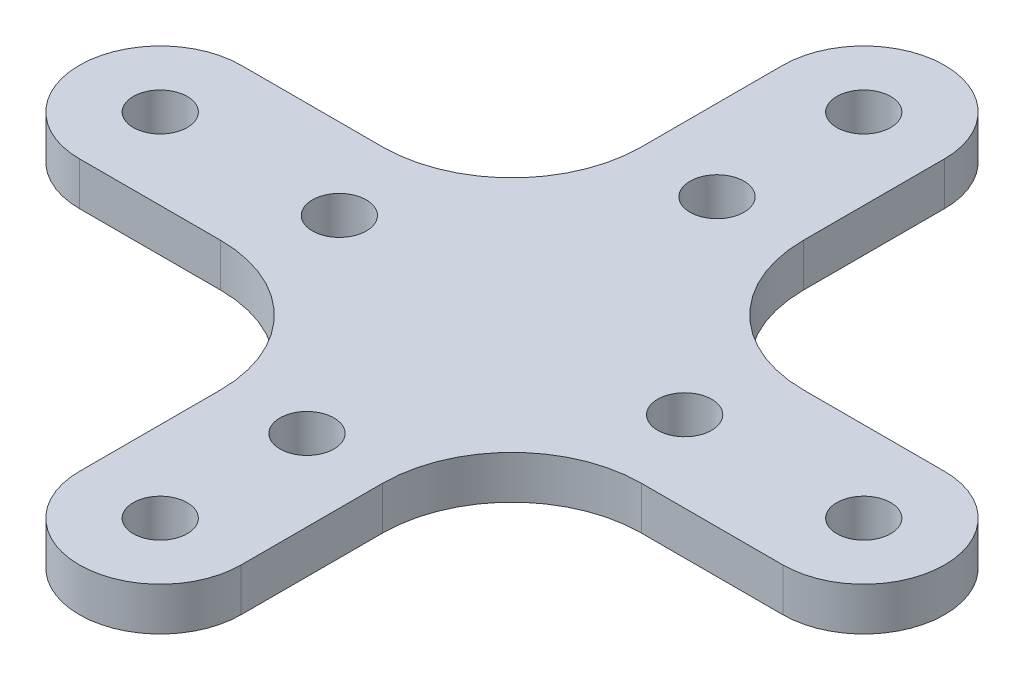
ISO-10303-21;
HEADER;
FILE_DESCRIPTION(('STEP AP214'),'2;1');
FILE_NAME('part.step','',(''),(''),'','','');
FILE_SCHEMA(('AUTOMOTIVE_DESIGN { 1 0 10303 214 1 1 1 1 }'));
ENDSEC;
DATA;
#1=APPLICATION_CONTEXT('core data for automotive mechanical design processes');
#2=APPLICATION_PROTOCOL_DEFINITION('international standard','automotive_design',2000,#1);
#3=PRODUCT_CONTEXT('',#1,'mechanical');
#4=PRODUCT('Part','Part','',(#3));
#5=PRODUCT_RELATED_PRODUCT_CATEGORY('part','',(#4));
#6=PRODUCT_DEFINITION_FORMATION('','',#4);
#7=PRODUCT_DEFINITION_CONTEXT('part definition',#1,'design');
#8=PRODUCT_DEFINITION('design','',#6,#7);
#9=PRODUCT_DEFINITION_SHAPE('','',#8);
#10=(LENGTH_UNIT() NAMED_UNIT(*) SI_UNIT(.MILLI.,.METRE.));
#11=(NAMED_UNIT(*) PLANE_ANGLE_UNIT() SI_UNIT($,.RADIAN.));
#12=(NAMED_UNIT(*) SI_UNIT($,.STERADIAN.) SOLID_ANGLE_UNIT());
#13=UNCERTAINTY_MEASURE_WITH_UNIT(LENGTH_MEASURE(1.E-05),#10,'distance_accuracy_value','');
#14=(GEOMETRIC_REPRESENTATION_CONTEXT(3) GLOBAL_UNCERTAINTY_ASSIGNED_CONTEXT((#13)) GLOBAL_UNIT_ASSIGNED_CONTEXT((#10,
#11,#12)) REPRESENTATION_CONTEXT('',''));
#15=CARTESIAN_POINT('',(0.,0.,0.));
#16=DIRECTION('',(0.,0.,1.));
#17=DIRECTION('',(1.,0.,0.));
#18=AXIS2_PLACEMENT_3D('',#15,#16,#17);
#19=CARTESIAN_POINT('',(0.,2.,-16.3));
#20=DIRECTION('',(0.,1.,0.));
#21=DIRECTION('',(0.,0.,1.));
#22=AXIS2_PLACEMENT_3D('',#19,#20,#21);
#23=PLANE('',#22);
#24=CARTESIAN_POINT('',(0.,2.,9.5));
#25=DIRECTION('',(0.,1.,0.));
#26=DIRECTION('',(0.,0.,1.));
#27=AXIS2_PLACEMENT_3D('',#24,#25,#26);
#28=CIRCLE('',#27,1.25);
#29=CARTESIAN_POINT('',(0.,2.,10.75));
#30=VERTEX_POINT('',#29);
#31=EDGE_CURVE('E412',#30,#30,#28,.T.);
#32=ORIENTED_EDGE('',*,*,#31,.F.);
#33=EDGE_LOOP('',(#32));
#34=FACE_BOUND('',#33,.T.);
#35=CARTESIAN_POINT('',(0.,2.,-9.5));
#36=DIRECTION('',(0.,1.,0.));
#37=DIRECTION('',(0.,0.,1.));
#38=AXIS2_PLACEMENT_3D('',#35,#36,#37);
#39=CIRCLE('',#38,1.25);
#40=CARTESIAN_POINT('',(0.,2.,-8.25));
#41=VERTEX_POINT('',#40);
#42=EDGE_CURVE('E428',#41,#41,#39,.T.);
#43=ORIENTED_EDGE('',*,*,#42,.F.);
#44=EDGE_LOOP('',(#43));
#45=FACE_BOUND('',#44,.T.);
#46=CARTESIAN_POINT('',(0.,2.,16.3));
#47=DIRECTION('',(0.,1.,0.));
#48=DIRECTION('',(0.,0.,1.));
#49=AXIS2_PLACEMENT_3D('',#46,#47,#48);
#50=CIRCLE('',#49,1.25);
#51=CARTESIAN_POINT('',(0.,2.,17.55));
#52=VERTEX_POINT('',#51);
#53=EDGE_CURVE('E444',#52,#52,#50,.T.);
#54=ORIENTED_EDGE('',*,*,#53,.F.);
#55=EDGE_LOOP('',(#54));
#56=FACE_BOUND('',#55,.T.);
#57=CARTESIAN_POINT('',(0.,2.,-16.3));
#58=DIRECTION('',(0.,1.,0.));
#59=DIRECTION('',(0.,0.,1.));
#60=AXIS2_PLACEMENT_3D('',#57,#58,#59);
#61=CIRCLE('',#60,1.25);
#62=CARTESIAN_POINT('',(0.,2.,-15.05));
#63=VERTEX_POINT('',#62);
#64=EDGE_CURVE('E194',#63,#63,#61,.T.);
#65=ORIENTED_EDGE('',*,*,#64,.F.);
#66=EDGE_LOOP('',(#65));
#67=FACE_BOUND('',#66,.T.);
#68=CARTESIAN_POINT('',(0.,2.,-16.3));
#69=DIRECTION('',(0.,1.,0.));
#70=DIRECTION('',(0.,0.,1.));
#71=AXIS2_PLACEMENT_3D('',#68,#69,#70);
#72=CIRCLE('',#71,3.75);
#73=CARTESIAN_POINT('',(3.74999999999999,2.,-16.3));
#74=VERTEX_POINT('',#73);
#75=CARTESIAN_POINT('',(-3.75,2.,-16.3));
#76=VERTEX_POINT('',#75);
#77=EDGE_CURVE('E236',#74,#76,#72,.T.);
#78=ORIENTED_EDGE('',*,*,#77,.T.);
#79=DIRECTION('',(0.,0.,1.));
#80=VECTOR('',#79,1.);
#81=CARTESIAN_POINT('',(-3.75,2.,-16.3));
#82=LINE('',#81,#80);
#83=CARTESIAN_POINT('',(-3.75,2.,-9.75000000000005));
#84=VERTEX_POINT('',#83);
#85=EDGE_CURVE('E124',#76,#84,#82,.T.);
#86=ORIENTED_EDGE('',*,*,#85,.T.);
#87=CARTESIAN_POINT('',(-9.75,2.,-9.75000000000001));
#88=DIRECTION('',(0.,-1.,0.));
#89=DIRECTION('',(0.,0.,-1.));
#90=AXIS2_PLACEMENT_3D('',#87,#88,#89);
#91=CIRCLE('',#90,6.);
#92=CARTESIAN_POINT('',(-9.75000000000004,2.,-3.75));
#93=VERTEX_POINT('',#92);
#94=EDGE_CURVE('E289',#84,#93,#91,.T.);
#95=ORIENTED_EDGE('',*,*,#94,.T.);
#96=DIRECTION('',(-1.,0.,0.));
#97=VECTOR('',#96,1.);
#98=CARTESIAN_POINT('',(-16.3,2.,-3.75));
#99=LINE('',#98,#97);
#100=CARTESIAN_POINT('',(-16.3,2.,-3.75));
#101=VERTEX_POINT('',#100);
#102=EDGE_CURVE('E309',#93,#101,#99,.T.);
#103=ORIENTED_EDGE('',*,*,#102,.T.);
#104=CARTESIAN_POINT('',(-16.3,2.,0.));
#105=DIRECTION('',(0.,1.,0.));
#106=DIRECTION('',(0.,0.,1.));
#107=AXIS2_PLACEMENT_3D('',#104,#105,#106);
#108=CIRCLE('',#107,3.75);
#109=CARTESIAN_POINT('',(-16.3,2.,3.75));
#110=VERTEX_POINT('',#109);
#111=EDGE_CURVE('E305',#101,#110,#108,.T.);
#112=ORIENTED_EDGE('',*,*,#111,.T.);
#113=DIRECTION('',(1.,0.,0.));
#114=VECTOR('',#113,1.);
#115=CARTESIAN_POINT('',(-16.3,2.,3.75));
#116=LINE('',#115,#114);
#117=CARTESIAN_POINT('',(-9.75000000000004,2.,3.75));
#118=VERTEX_POINT('',#117);
#119=EDGE_CURVE('E308',#110,#118,#116,.T.);
#120=ORIENTED_EDGE('',*,*,#119,.T.);
#121=CARTESIAN_POINT('',(-9.74999999999999,2.,9.75));
#122=DIRECTION('',(0.,-1.,0.));
#123=DIRECTION('',(0.,0.,1.));
#124=AXIS2_PLACEMENT_3D('',#121,#122,#123);
#125=CIRCLE('',#124,6.);
#126=CARTESIAN_POINT('',(-3.75,2.,9.75000000000004));
#127=VERTEX_POINT('',#126);
#128=EDGE_CURVE('E313',#118,#127,#125,.T.);
#129=ORIENTED_EDGE('',*,*,#128,.T.);
#130=DIRECTION('',(0.,0.,1.));
#131=VECTOR('',#130,1.);
#132=CARTESIAN_POINT('',(-3.75,2.,9.75000000000004));
#133=LINE('',#132,#131);
#134=CARTESIAN_POINT('',(-3.75,2.,16.3));
#135=VERTEX_POINT('',#134);
#136=EDGE_CURVE('E320',#127,#135,#133,.T.);
#137=ORIENTED_EDGE('',*,*,#136,.T.);
#138=CARTESIAN_POINT('',(0.,2.,16.3));
#139=DIRECTION('',(0.,1.,0.));
#140=DIRECTION('',(0.,0.,1.));
#141=AXIS2_PLACEMENT_3D('',#138,#139,#140);
#142=CIRCLE('',#141,3.75);
#143=CARTESIAN_POINT('',(3.75,2.,16.3));
#144=VERTEX_POINT('',#143);
#145=EDGE_CURVE('E323',#135,#144,#142,.T.);
#146=ORIENTED_EDGE('',*,*,#145,.T.);
#147=DIRECTION('',(0.,0.,-1.));
#148=VECTOR('',#147,1.);
#149=CARTESIAN_POINT('',(3.74999999999999,2.,9.75000000000004));
#150=LINE('',#149,#148);
#151=CARTESIAN_POINT('',(3.74999999999999,2.,9.75000000000004));
#152=VERTEX_POINT('',#151);
#153=EDGE_CURVE('E326',#144,#152,#150,.T.);
#154=ORIENTED_EDGE('',*,*,#153,.T.);
#155=CARTESIAN_POINT('',(9.74999999999999,2.,9.75));
#156=DIRECTION('',(0.,-1.,0.));
#157=DIRECTION('',(0.,0.,1.));
#158=AXIS2_PLACEMENT_3D('',#155,#156,#157);
#159=CIRCLE('',#158,6.);
#160=CARTESIAN_POINT('',(9.75000000000004,2.,3.75));
#161=VERTEX_POINT('',#160);
#162=EDGE_CURVE('E329',#152,#161,#159,.T.);
#163=ORIENTED_EDGE('',*,*,#162,.T.);
#164=DIRECTION('',(1.,0.,0.));
#165=VECTOR('',#164,1.);
#166=CARTESIAN_POINT('',(9.75000000000004,2.,3.75));
#167=LINE('',#166,#165);
#168=CARTESIAN_POINT('',(16.3,2.,3.75));
#169=VERTEX_POINT('',#168);
#170=EDGE_CURVE('E332',#161,#169,#167,.T.);
#171=ORIENTED_EDGE('',*,*,#170,.T.);
#172=CARTESIAN_POINT('',(16.3,2.,0.));
#173=DIRECTION('',(0.,1.,0.));
#174=DIRECTION('',(0.,0.,1.));
#175=AXIS2_PLACEMENT_3D('',#172,#173,#174);
#176=CIRCLE('',#175,3.75);
#177=CARTESIAN_POINT('',(16.3,2.,-3.75000000000001));
#178=VERTEX_POINT('',#177);
#179=EDGE_CURVE('E167',#169,#178,#176,.T.);
#180=ORIENTED_EDGE('',*,*,#179,.T.);
#181=DIRECTION('',(-1.,0.,0.));
#182=VECTOR('',#181,1.);
#183=CARTESIAN_POINT('',(9.75000000000004,2.,-3.75000000000001));
#184=LINE('',#183,#182);
#185=CARTESIAN_POINT('',(9.75000000000004,2.,-3.75000000000001));
#186=VERTEX_POINT('',#185);
#187=EDGE_CURVE('E161',#178,#186,#184,.T.);
#188=ORIENTED_EDGE('',*,*,#187,.T.);
#189=CARTESIAN_POINT('',(9.74999999999999,2.,-9.75000000000001));
#190=DIRECTION('',(0.,-1.,0.));
#191=DIRECTION('',(0.,0.,1.));
#192=AXIS2_PLACEMENT_3D('',#189,#190,#191);
#193=CIRCLE('',#192,6.);
#194=CARTESIAN_POINT('',(3.74999999999999,2.,-9.75000000000005));
#195=VERTEX_POINT('',#194);
#196=EDGE_CURVE('E165',#186,#195,#193,.T.);
#197=ORIENTED_EDGE('',*,*,#196,.T.);
#198=DIRECTION('',(0.,0.,-1.));
#199=VECTOR('',#198,1.);
#200=CARTESIAN_POINT('',(3.74999999999999,2.,-16.3));
#201=LINE('',#200,#199);
#202=EDGE_CURVE('E57',#195,#74,#201,.T.);
#203=ORIENTED_EDGE('',*,*,#202,.T.);
#204=EDGE_LOOP('',(#78,#86,#95,#103,#112,#120,#129,#137,#146,#154,#163,#171,#180,#188,#197,#203));
#205=FACE_BOUND('',#204,.T.);
#206=CARTESIAN_POINT('',(-16.3,2.,0.));
#207=DIRECTION('',(0.,1.,0.));
#208=DIRECTION('',(0.,0.,1.));
#209=AXIS2_PLACEMENT_3D('',#206,#207,#208);
#210=CIRCLE('',#209,1.25);
#211=CARTESIAN_POINT('',(-16.3,2.,1.25));
#212=VERTEX_POINT('',#211);
#213=EDGE_CURVE('E452',#212,#212,#210,.T.);
#214=ORIENTED_EDGE('',*,*,#213,.F.);
#215=EDGE_LOOP('',(#214));
#216=FACE_BOUND('',#215,.T.);
#217=CARTESIAN_POINT('',(16.3,2.,0.));
#218=DIRECTION('',(0.,1.,0.));
#219=DIRECTION('',(0.,0.,1.));
#220=AXIS2_PLACEMENT_3D('',#217,#218,#219);
#221=CIRCLE('',#220,1.25);
#222=CARTESIAN_POINT('',(16.3,2.,1.25));
#223=VERTEX_POINT('',#222);
#224=EDGE_CURVE('E436',#223,#223,#221,.T.);
#225=ORIENTED_EDGE('',*,*,#224,.F.);
#226=EDGE_LOOP('',(#225));
#227=FACE_BOUND('',#226,.T.);
#228=CARTESIAN_POINT('',(-8.,2.,0.));
#229=DIRECTION('',(0.,1.,0.));
#230=DIRECTION('',(0.,0.,1.));
#231=AXIS2_PLACEMENT_3D('',#228,#229,#230);
#232=CIRCLE('',#231,1.25);
#233=CARTESIAN_POINT('',(-8.,2.,1.25));
#234=VERTEX_POINT('',#233);
#235=EDGE_CURVE('E420',#234,#234,#232,.T.);
#236=ORIENTED_EDGE('',*,*,#235,.F.);
#237=EDGE_LOOP('',(#236));
#238=FACE_BOUND('',#237,.T.);
#239=CARTESIAN_POINT('',(8.,2.,0.));
#240=DIRECTION('',(0.,1.,0.));
#241=DIRECTION('',(0.,0.,1.));
#242=AXIS2_PLACEMENT_3D('',#239,#240,#241);
#243=CIRCLE('',#242,1.25);
#244=CARTESIAN_POINT('',(8.,2.,1.25));
#245=VERTEX_POINT('',#244);
#246=EDGE_CURVE('E401',#245,#245,#243,.T.);
#247=ORIENTED_EDGE('',*,*,#246,.F.);
#248=EDGE_LOOP('',(#247));
#249=FACE_BOUND('',#248,.T.);
#250=ADVANCED_FACE('F39',(#34,#45,#56,#67,#205,#216,#227,#238,#249),#23,.T.);
#251=CARTESIAN_POINT('',(0.,0.,-16.3));
#252=DIRECTION('',(0.,1.,0.));
#253=DIRECTION('',(0.,0.,1.));
#254=AXIS2_PLACEMENT_3D('',#251,#252,#253);
#255=PLANE('',#254);
#256=CARTESIAN_POINT('',(0.,0.,-16.3));
#257=DIRECTION('',(0.,1.,0.));
#258=DIRECTION('',(0.,0.,1.));
#259=AXIS2_PLACEMENT_3D('',#256,#257,#258);
#260=CIRCLE('',#259,3.75);
#261=CARTESIAN_POINT('',(3.74999999999999,0.,-16.3));
#262=VERTEX_POINT('',#261);
#263=CARTESIAN_POINT('',(-3.75,0.,-16.3));
#264=VERTEX_POINT('',#263);
#265=EDGE_CURVE('E189',#262,#264,#260,.T.);
#266=ORIENTED_EDGE('',*,*,#265,.F.);
#267=DIRECTION('',(0.,0.,-1.));
#268=VECTOR('',#267,1.);
#269=CARTESIAN_POINT('',(3.74999999999999,0.,-16.3));
#270=LINE('',#269,#268);
#271=CARTESIAN_POINT('',(3.74999999999999,0.,-9.75000000000005));
#272=VERTEX_POINT('',#271);
#273=EDGE_CURVE('E116',#272,#262,#270,.T.);
#274=ORIENTED_EDGE('',*,*,#273,.F.);
#275=CARTESIAN_POINT('',(9.74999999999999,0.,-9.75000000000001));
#276=DIRECTION('',(0.,-1.,0.));
#277=DIRECTION('',(0.,0.,1.));
#278=AXIS2_PLACEMENT_3D('',#275,#276,#277);
#279=CIRCLE('',#278,6.);
#280=CARTESIAN_POINT('',(9.75000000000004,0.,-3.75000000000001));
#281=VERTEX_POINT('',#280);
#282=EDGE_CURVE('E110',#281,#272,#279,.T.);
#283=ORIENTED_EDGE('',*,*,#282,.F.);
#284=DIRECTION('',(-1.,0.,0.));
#285=VECTOR('',#284,1.);
#286=CARTESIAN_POINT('',(9.75000000000004,0.,-3.75000000000001));
#287=LINE('',#286,#285);
#288=CARTESIAN_POINT('',(16.3,0.,-3.75000000000001));
#289=VERTEX_POINT('',#288);
#290=EDGE_CURVE('E176',#289,#281,#287,.T.);
#291=ORIENTED_EDGE('',*,*,#290,.F.);
#292=CARTESIAN_POINT('',(16.3,0.,0.));
#293=DIRECTION('',(0.,1.,0.));
#294=DIRECTION('',(0.,0.,1.));
#295=AXIS2_PLACEMENT_3D('',#292,#293,#294);
#296=CIRCLE('',#295,3.75);
#297=CARTESIAN_POINT('',(16.3,0.,3.75));
#298=VERTEX_POINT('',#297);
#299=EDGE_CURVE('E227',#298,#289,#296,.T.);
#300=ORIENTED_EDGE('',*,*,#299,.F.);
#301=DIRECTION('',(1.,0.,0.));
#302=VECTOR('',#301,1.);
#303=CARTESIAN_POINT('',(9.75000000000004,0.,3.75));
#304=LINE('',#303,#302);
#305=CARTESIAN_POINT('',(9.75000000000004,0.,3.75));
#306=VERTEX_POINT('',#305);
#307=EDGE_CURVE('E224',#306,#298,#304,.T.);
#308=ORIENTED_EDGE('',*,*,#307,.F.);
#309=CARTESIAN_POINT('',(9.74999999999999,0.,9.75));
#310=DIRECTION('',(0.,-1.,0.));
#311=DIRECTION('',(0.,0.,1.));
#312=AXIS2_PLACEMENT_3D('',#309,#310,#311);
#313=CIRCLE('',#312,6.);
#314=CARTESIAN_POINT('',(3.74999999999999,0.,9.75000000000004));
#315=VERTEX_POINT('',#314);
#316=EDGE_CURVE('E221',#315,#306,#313,.T.);
#317=ORIENTED_EDGE('',*,*,#316,.F.);
#318=DIRECTION('',(0.,0.,-1.));
#319=VECTOR('',#318,1.);
#320=CARTESIAN_POINT('',(3.74999999999999,0.,9.75000000000004));
#321=LINE('',#320,#319);
#322=CARTESIAN_POINT('',(3.75,0.,16.3));
#323=VERTEX_POINT('',#322);
#324=EDGE_CURVE('E218',#323,#315,#321,.T.);
#325=ORIENTED_EDGE('',*,*,#324,.F.);
#326=CARTESIAN_POINT('',(0.,0.,16.3));
#327=DIRECTION('',(0.,1.,0.));
#328=DIRECTION('',(0.,0.,1.));
#329=AXIS2_PLACEMENT_3D('',#326,#327,#328);
#330=CIRCLE('',#329,3.75);
#331=CARTESIAN_POINT('',(-3.75,0.,16.3));
#332=VERTEX_POINT('',#331);
#333=EDGE_CURVE('E215',#332,#323,#330,.T.);
#334=ORIENTED_EDGE('',*,*,#333,.F.);
#335=DIRECTION('',(0.,0.,1.));
#336=VECTOR('',#335,1.);
#337=CARTESIAN_POINT('',(-3.75,0.,9.75000000000004));
#338=LINE('',#337,#336);
#339=CARTESIAN_POINT('',(-3.75,0.,9.75000000000004));
#340=VERTEX_POINT('',#339);
#341=EDGE_CURVE('E212',#340,#332,#338,.T.);
#342=ORIENTED_EDGE('',*,*,#341,.F.);
#343=CARTESIAN_POINT('',(-9.74999999999999,0.,9.75));
#344=DIRECTION('',(0.,-1.,0.));
#345=DIRECTION('',(0.,0.,1.));
#346=AXIS2_PLACEMENT_3D('',#343,#344,#345);
#347=CIRCLE('',#346,6.);
#348=CARTESIAN_POINT('',(-9.75000000000004,0.,3.75));
#349=VERTEX_POINT('',#348);
#350=EDGE_CURVE('E209',#349,#340,#347,.T.);
#351=ORIENTED_EDGE('',*,*,#350,.F.);
#352=DIRECTION('',(1.,0.,0.));
#353=VECTOR('',#352,1.);
#354=CARTESIAN_POINT('',(-16.3,0.,3.75));
#355=LINE('',#354,#353);
#356=CARTESIAN_POINT('',(-16.3,0.,3.75));
#357=VERTEX_POINT('',#356);
#358=EDGE_CURVE('E206',#357,#349,#355,.T.);
#359=ORIENTED_EDGE('',*,*,#358,.F.);
#360=CARTESIAN_POINT('',(-16.3,0.,0.));
#361=DIRECTION('',(0.,1.,0.));
#362=DIRECTION('',(0.,0.,1.));
#363=AXIS2_PLACEMENT_3D('',#360,#361,#362);
#364=CIRCLE('',#363,3.75);
#365=CARTESIAN_POINT('',(-16.3,0.,-3.75));
#366=VERTEX_POINT('',#365);
#367=EDGE_CURVE('E203',#366,#357,#364,.T.);
#368=ORIENTED_EDGE('',*,*,#367,.F.);
#369=DIRECTION('',(-1.,0.,0.));
#370=VECTOR('',#369,1.);
#371=CARTESIAN_POINT('',(-16.3,0.,-3.75));
#372=LINE('',#371,#370);
#373=CARTESIAN_POINT('',(-9.75000000000004,0.,-3.75));
#374=VERTEX_POINT('',#373);
#375=EDGE_CURVE('E200',#374,#366,#372,.T.);
#376=ORIENTED_EDGE('',*,*,#375,.F.);
#377=CARTESIAN_POINT('',(-9.75,0.,-9.75000000000001));
#378=DIRECTION('',(0.,-1.,0.));
#379=DIRECTION('',(0.,0.,-1.));
#380=AXIS2_PLACEMENT_3D('',#377,#378,#379);
#381=CIRCLE('',#380,6.);
#382=CARTESIAN_POINT('',(-3.75,0.,-9.75000000000005));
#383=VERTEX_POINT('',#382);
#384=EDGE_CURVE('E197',#383,#374,#381,.T.);
#385=ORIENTED_EDGE('',*,*,#384,.F.);
#386=DIRECTION('',(0.,0.,1.));
#387=VECTOR('',#386,1.);
#388=CARTESIAN_POINT('',(-3.75,0.,-16.3));
#389=LINE('',#388,#387);
#390=EDGE_CURVE('E193',#264,#383,#389,.T.);
#391=ORIENTED_EDGE('',*,*,#390,.F.);
#392=EDGE_LOOP('',(#266,#274,#283,#291,#300,#308,#317,#325,#334,#342,#351,#359,#368,#376,#385,#391));
#393=FACE_BOUND('',#392,.T.);
#394=CARTESIAN_POINT('',(0.,0.,-16.3));
#395=DIRECTION('',(0.,1.,0.));
#396=DIRECTION('',(0.,0.,1.));
#397=AXIS2_PLACEMENT_3D('',#394,#395,#396);
#398=CIRCLE('',#397,1.25);
#399=CARTESIAN_POINT('',(0.,0.,-15.05));
#400=VERTEX_POINT('',#399);
#401=EDGE_CURVE('E456',#400,#400,#398,.T.);
#402=ORIENTED_EDGE('',*,*,#401,.T.);
#403=EDGE_LOOP('',(#402));
#404=FACE_BOUND('',#403,.T.);
#405=CARTESIAN_POINT('',(-16.3,0.,0.));
#406=DIRECTION('',(0.,1.,0.));
#407=DIRECTION('',(0.,0.,1.));
#408=AXIS2_PLACEMENT_3D('',#405,#406,#407);
#409=CIRCLE('',#408,1.25);
#410=CARTESIAN_POINT('',(-16.3,0.,1.25));
#411=VERTEX_POINT('',#410);
#412=EDGE_CURVE('E448',#411,#411,#409,.T.);
#413=ORIENTED_EDGE('',*,*,#412,.T.);
#414=EDGE_LOOP('',(#413));
#415=FACE_BOUND('',#414,.T.);
#416=CARTESIAN_POINT('',(0.,0.,16.3));
#417=DIRECTION('',(0.,1.,0.));
#418=DIRECTION('',(0.,0.,1.));
#419=AXIS2_PLACEMENT_3D('',#416,#417,#418);
#420=CIRCLE('',#419,1.25);
#421=CARTESIAN_POINT('',(0.,0.,17.55));
#422=VERTEX_POINT('',#421);
#423=EDGE_CURVE('E440',#422,#422,#420,.T.);
#424=ORIENTED_EDGE('',*,*,#423,.T.);
#425=EDGE_LOOP('',(#424));
#426=FACE_BOUND('',#425,.T.);
#427=CARTESIAN_POINT('',(16.3,0.,0.));
#428=DIRECTION('',(0.,1.,0.));
#429=DIRECTION('',(0.,0.,1.));
#430=AXIS2_PLACEMENT_3D('',#427,#428,#429);
#431=CIRCLE('',#430,1.25);
#432=CARTESIAN_POINT('',(16.3,0.,1.25));
#433=VERTEX_POINT('',#432);
#434=EDGE_CURVE('E432',#433,#433,#431,.T.);
#435=ORIENTED_EDGE('',*,*,#434,.T.);
#436=EDGE_LOOP('',(#435));
#437=FACE_BOUND('',#436,.T.);
#438=CARTESIAN_POINT('',(0.,0.,-9.5));
#439=DIRECTION('',(0.,1.,0.));
#440=DIRECTION('',(0.,0.,1.));
#441=AXIS2_PLACEMENT_3D('',#438,#439,#440);
#442=CIRCLE('',#441,1.25);
#443=CARTESIAN_POINT('',(0.,0.,-8.25));
#444=VERTEX_POINT('',#443);
#445=EDGE_CURVE('E424',#444,#444,#442,.T.);
#446=ORIENTED_EDGE('',*,*,#445,.T.);
#447=EDGE_LOOP('',(#446));
#448=FACE_BOUND('',#447,.T.);
#449=CARTESIAN_POINT('',(-8.,0.,0.));
#450=DIRECTION('',(0.,1.,0.));
#451=DIRECTION('',(0.,0.,1.));
#452=AXIS2_PLACEMENT_3D('',#449,#450,#451);
#453=CIRCLE('',#452,1.25);
#454=CARTESIAN_POINT('',(-8.,0.,1.25));
#455=VERTEX_POINT('',#454);
#456=EDGE_CURVE('E416',#455,#455,#453,.T.);
#457=ORIENTED_EDGE('',*,*,#456,.T.);
#458=EDGE_LOOP('',(#457));
#459=FACE_BOUND('',#458,.T.);
#460=CARTESIAN_POINT('',(0.,0.,9.5));
#461=DIRECTION('',(0.,1.,0.));
#462=DIRECTION('',(0.,0.,1.));
#463=AXIS2_PLACEMENT_3D('',#460,#461,#462);
#464=CIRCLE('',#463,1.25);
#465=CARTESIAN_POINT('',(0.,0.,10.75));
#466=VERTEX_POINT('',#465);
#467=EDGE_CURVE('E409',#466,#466,#464,.T.);
#468=ORIENTED_EDGE('',*,*,#467,.T.);
#469=EDGE_LOOP('',(#468));
#470=FACE_BOUND('',#469,.T.);
#471=CARTESIAN_POINT('',(8.,0.,0.));
#472=DIRECTION('',(0.,1.,0.));
#473=DIRECTION('',(0.,0.,1.));
#474=AXIS2_PLACEMENT_3D('',#471,#472,#473);
#475=CIRCLE('',#474,1.25);
#476=CARTESIAN_POINT('',(8.,0.,1.25));
#477=VERTEX_POINT('',#476);
#478=EDGE_CURVE('E404',#477,#477,#475,.T.);
#479=ORIENTED_EDGE('',*,*,#478,.T.);
#480=EDGE_LOOP('',(#479));
#481=FACE_BOUND('',#480,.T.);
#482=ADVANCED_FACE('F293',(#393,#404,#415,#426,#437,#448,#459,#470,#481),#255,.F.);
#483=CARTESIAN_POINT('',(0.,2.,-16.3));
#484=DIRECTION('',(0.,-1.,0.));
#485=DIRECTION('',(0.,0.,-1.));
#486=AXIS2_PLACEMENT_3D('',#483,#484,#485);
#487=CYLINDRICAL_SURFACE('',#486,3.75);
#488=ORIENTED_EDGE('',*,*,#265,.T.);
#489=DIRECTION('',(0.,-1.,0.));
#490=VECTOR('',#489,1.);
#491=CARTESIAN_POINT('',(-3.75,2.,-16.3));
#492=LINE('',#491,#490);
#493=EDGE_CURVE('E11',#76,#264,#492,.T.);
#494=ORIENTED_EDGE('',*,*,#493,.F.);
#495=ORIENTED_EDGE('',*,*,#77,.F.);
#496=DIRECTION('',(0.,-1.,0.));
#497=VECTOR('',#496,1.);
#498=CARTESIAN_POINT('',(3.74999999999999,2.,-16.3));
#499=LINE('',#498,#497);
#500=EDGE_CURVE('E185',#74,#262,#499,.T.);
#501=ORIENTED_EDGE('',*,*,#500,.T.);
#502=EDGE_LOOP('',(#488,#494,#495,#501));
#503=FACE_BOUND('',#502,.T.);
#504=ADVANCED_FACE('F41',(#503),#487,.T.);
#505=CARTESIAN_POINT('',(-3.75,2.,-16.3));
#506=DIRECTION('',(1.,0.,0.));
#507=DIRECTION('',(0.,0.,-1.));
#508=AXIS2_PLACEMENT_3D('',#505,#506,#507);
#509=PLANE('',#508);
#510=ORIENTED_EDGE('',*,*,#390,.T.);
#511=DIRECTION('',(0.,-1.,0.));
#512=VECTOR('',#511,1.);
#513=CARTESIAN_POINT('',(-3.75,2.,-9.75000000000005));
#514=LINE('',#513,#512);
#515=EDGE_CURVE('E49',#84,#383,#514,.T.);
#516=ORIENTED_EDGE('',*,*,#515,.F.);
#517=ORIENTED_EDGE('',*,*,#85,.F.);
#518=ORIENTED_EDGE('',*,*,#493,.T.);
#519=EDGE_LOOP('',(#510,#516,#517,#518));
#520=FACE_BOUND('',#519,.T.);
#521=ADVANCED_FACE('F648',(#520),#509,.F.);
#522=CARTESIAN_POINT('',(-9.75,2.,-9.75000000000001));
#523=DIRECTION('',(0.,-1.,0.));
#524=DIRECTION('',(0.,0.,-1.));
#525=AXIS2_PLACEMENT_3D('',#522,#523,#524);
#526=CYLINDRICAL_SURFACE('',#525,6.);
#527=ORIENTED_EDGE('',*,*,#384,.T.);
#528=DIRECTION('',(0.,-1.,0.));
#529=VECTOR('',#528,1.);
#530=CARTESIAN_POINT('',(-9.75000000000004,2.,-3.75));
#531=LINE('',#530,#529);
#532=EDGE_CURVE('E279',#93,#374,#531,.T.);
#533=ORIENTED_EDGE('',*,*,#532,.F.);
#534=ORIENTED_EDGE('',*,*,#94,.F.);
#535=ORIENTED_EDGE('',*,*,#515,.T.);
#536=EDGE_LOOP('',(#527,#533,#534,#535));
#537=FACE_BOUND('',#536,.T.);
#538=ADVANCED_FACE('F287',(#537),#526,.F.);
#539=CARTESIAN_POINT('',(-16.3,2.,-3.75));
#540=DIRECTION('',(0.,0.,1.));
#541=DIRECTION('',(1.,0.,0.));
#542=AXIS2_PLACEMENT_3D('',#539,#540,#541);
#543=PLANE('',#542);
#544=ORIENTED_EDGE('',*,*,#375,.T.);
#545=DIRECTION('',(0.,-1.,0.));
#546=VECTOR('',#545,1.);
#547=CARTESIAN_POINT('',(-16.3,2.,-3.75));
#548=LINE('',#547,#546);
#549=EDGE_CURVE('E275',#101,#366,#548,.T.);
#550=ORIENTED_EDGE('',*,*,#549,.F.);
#551=ORIENTED_EDGE('',*,*,#102,.F.);
#552=ORIENTED_EDGE('',*,*,#532,.T.);
#553=EDGE_LOOP('',(#544,#550,#551,#552));
#554=FACE_BOUND('',#553,.T.);
#555=ADVANCED_FACE('F299',(#554),#543,.F.);
#556=CARTESIAN_POINT('',(-16.3,2.,0.));
#557=DIRECTION('',(0.,-1.,0.));
#558=DIRECTION('',(0.,0.,-1.));
#559=AXIS2_PLACEMENT_3D('',#556,#557,#558);
#560=CYLINDRICAL_SURFACE('',#559,3.75);
#561=ORIENTED_EDGE('',*,*,#367,.T.);
#562=DIRECTION('',(0.,-1.,0.));
#563=VECTOR('',#562,1.);
#564=CARTESIAN_POINT('',(-16.3,2.,3.75));
#565=LINE('',#564,#563);
#566=EDGE_CURVE('E271',#110,#357,#565,.T.);
#567=ORIENTED_EDGE('',*,*,#566,.F.);
#568=ORIENTED_EDGE('',*,*,#111,.F.);
#569=ORIENTED_EDGE('',*,*,#549,.T.);
#570=EDGE_LOOP('',(#561,#567,#568,#569));
#571=FACE_BOUND('',#570,.T.);
#572=ADVANCED_FACE('F303',(#571),#560,.T.);
#573=CARTESIAN_POINT('',(-16.3,2.,3.75));
#574=DIRECTION('',(0.,0.,-1.));
#575=DIRECTION('',(-1.,0.,0.));
#576=AXIS2_PLACEMENT_3D('',#573,#574,#575);
#577=PLANE('',#576);
#578=ORIENTED_EDGE('',*,*,#358,.T.);
#579=DIRECTION('',(0.,-1.,0.));
#580=VECTOR('',#579,1.);
#581=CARTESIAN_POINT('',(-9.75000000000004,2.,3.75));
#582=LINE('',#581,#580);
#583=EDGE_CURVE('E267',#118,#349,#582,.T.);
#584=ORIENTED_EDGE('',*,*,#583,.F.);
#585=ORIENTED_EDGE('',*,*,#119,.F.);
#586=ORIENTED_EDGE('',*,*,#566,.T.);
#587=EDGE_LOOP('',(#578,#584,#585,#586));
#588=FACE_BOUND('',#587,.T.);
#589=ADVANCED_FACE('F613',(#588),#577,.F.);
#590=CARTESIAN_POINT('',(-9.74999999999999,2.,9.75));
#591=DIRECTION('',(0.,-1.,0.));
#592=DIRECTION('',(0.,0.,-1.));
#593=AXIS2_PLACEMENT_3D('',#590,#591,#592);
#594=CYLINDRICAL_SURFACE('',#593,6.);
#595=ORIENTED_EDGE('',*,*,#350,.T.);
#596=DIRECTION('',(0.,-1.,0.));
#597=VECTOR('',#596,1.);
#598=CARTESIAN_POINT('',(-3.75,2.,9.75000000000004));
#599=LINE('',#598,#597);
#600=EDGE_CURVE('E263',#127,#340,#599,.T.);
#601=ORIENTED_EDGE('',*,*,#600,.F.);
#602=ORIENTED_EDGE('',*,*,#128,.F.);
#603=ORIENTED_EDGE('',*,*,#583,.T.);
#604=EDGE_LOOP('',(#595,#601,#602,#603));
#605=FACE_BOUND('',#604,.T.);
#606=ADVANCED_FACE('F603',(#605),#594,.F.);
#607=CARTESIAN_POINT('',(-3.75,2.,9.75000000000004));
#608=DIRECTION('',(1.,0.,0.));
#609=DIRECTION('',(0.,0.,-1.));
#610=AXIS2_PLACEMENT_3D('',#607,#608,#609);
#611=PLANE('',#610);
#612=ORIENTED_EDGE('',*,*,#341,.T.);
#613=DIRECTION('',(0.,-1.,0.));
#614=VECTOR('',#613,1.);
#615=CARTESIAN_POINT('',(-3.75,2.,16.3));
#616=LINE('',#615,#614);
#617=EDGE_CURVE('E259',#135,#332,#616,.T.);
#618=ORIENTED_EDGE('',*,*,#617,.F.);
#619=ORIENTED_EDGE('',*,*,#136,.F.);
#620=ORIENTED_EDGE('',*,*,#600,.T.);
#621=EDGE_LOOP('',(#612,#618,#619,#620));
#622=FACE_BOUND('',#621,.T.);
#623=ADVANCED_FACE('F593',(#622),#611,.F.);
#624=CARTESIAN_POINT('',(0.,2.,16.3));
#625=DIRECTION('',(0.,-1.,0.));
#626=DIRECTION('',(0.,0.,-1.));
#627=AXIS2_PLACEMENT_3D('',#624,#625,#626);
#628=CYLINDRICAL_SURFACE('',#627,3.75);
#629=ORIENTED_EDGE('',*,*,#333,.T.);
#630=DIRECTION('',(0.,-1.,0.));
#631=VECTOR('',#630,1.);
#632=CARTESIAN_POINT('',(3.75,2.,16.3));
#633=LINE('',#632,#631);
#634=EDGE_CURVE('E255',#144,#323,#633,.T.);
#635=ORIENTED_EDGE('',*,*,#634,.F.);
#636=ORIENTED_EDGE('',*,*,#145,.F.);
#637=ORIENTED_EDGE('',*,*,#617,.T.);
#638=EDGE_LOOP('',(#629,#635,#636,#637));
#639=FACE_BOUND('',#638,.T.);
#640=ADVANCED_FACE('F583',(#639),#628,.T.);
#641=CARTESIAN_POINT('',(3.74999999999999,2.,9.75000000000004));
#642=DIRECTION('',(-1.,0.,0.));
#643=DIRECTION('',(0.,0.,1.));
#644=AXIS2_PLACEMENT_3D('',#641,#642,#643);
#645=PLANE('',#644);
#646=ORIENTED_EDGE('',*,*,#324,.T.);
#647=DIRECTION('',(0.,-1.,0.));
#648=VECTOR('',#647,1.);
#649=CARTESIAN_POINT('',(3.74999999999999,2.,9.75000000000004));
#650=LINE('',#649,#648);
#651=EDGE_CURVE('E251',#152,#315,#650,.T.);
#652=ORIENTED_EDGE('',*,*,#651,.F.);
#653=ORIENTED_EDGE('',*,*,#153,.F.);
#654=ORIENTED_EDGE('',*,*,#634,.T.);
#655=EDGE_LOOP('',(#646,#652,#653,#654));
#656=FACE_BOUND('',#655,.T.);
#657=ADVANCED_FACE('F573',(#656),#645,.F.);
#658=CARTESIAN_POINT('',(9.74999999999999,2.,9.75));
#659=DIRECTION('',(0.,-1.,0.));
#660=DIRECTION('',(0.,0.,-1.));
#661=AXIS2_PLACEMENT_3D('',#658,#659,#660);
#662=CYLINDRICAL_SURFACE('',#661,6.);
#663=ORIENTED_EDGE('',*,*,#316,.T.);
#664=DIRECTION('',(0.,-1.,0.));
#665=VECTOR('',#664,1.);
#666=CARTESIAN_POINT('',(9.75000000000004,2.,3.75));
#667=LINE('',#666,#665);
#668=EDGE_CURVE('E247',#161,#306,#667,.T.);
#669=ORIENTED_EDGE('',*,*,#668,.F.);
#670=ORIENTED_EDGE('',*,*,#162,.F.);
#671=ORIENTED_EDGE('',*,*,#651,.T.);
#672=EDGE_LOOP('',(#663,#669,#670,#671));
#673=FACE_BOUND('',#672,.T.);
#674=ADVANCED_FACE('F564',(#673),#662,.F.);
#675=CARTESIAN_POINT('',(9.75000000000004,2.,3.75));
#676=DIRECTION('',(0.,0.,-1.));
#677=DIRECTION('',(-1.,0.,0.));
#678=AXIS2_PLACEMENT_3D('',#675,#676,#677);
#679=PLANE('',#678);
#680=ORIENTED_EDGE('',*,*,#307,.T.);
#681=DIRECTION('',(0.,-1.,0.));
#682=VECTOR('',#681,1.);
#683=CARTESIAN_POINT('',(16.3,2.,3.75));
#684=LINE('',#683,#682);
#685=EDGE_CURVE('E243',#169,#298,#684,.T.);
#686=ORIENTED_EDGE('',*,*,#685,.F.);
#687=ORIENTED_EDGE('',*,*,#170,.F.);
#688=ORIENTED_EDGE('',*,*,#668,.T.);
#689=EDGE_LOOP('',(#680,#686,#687,#688));
#690=FACE_BOUND('',#689,.T.);
#691=ADVANCED_FACE('F340',(#690),#679,.F.);
#692=CARTESIAN_POINT('',(16.3,2.,0.));
#693=DIRECTION('',(0.,-1.,0.));
#694=DIRECTION('',(0.,0.,-1.));
#695=AXIS2_PLACEMENT_3D('',#692,#693,#694);
#696=CYLINDRICAL_SURFACE('',#695,3.75);
#697=ORIENTED_EDGE('',*,*,#299,.T.);
#698=DIRECTION('',(0.,-1.,0.));
#699=VECTOR('',#698,1.);
#700=CARTESIAN_POINT('',(16.3,2.,-3.75000000000001));
#701=LINE('',#700,#699);
#702=EDGE_CURVE('E178',#178,#289,#701,.T.);
#703=ORIENTED_EDGE('',*,*,#702,.F.);
#704=ORIENTED_EDGE('',*,*,#179,.F.);
#705=ORIENTED_EDGE('',*,*,#685,.T.);
#706=EDGE_LOOP('',(#697,#703,#704,#705));
#707=FACE_BOUND('',#706,.T.);
#708=ADVANCED_FACE('F344',(#707),#696,.T.);
#709=CARTESIAN_POINT('',(9.75000000000004,2.,-3.75000000000001));
#710=DIRECTION('',(0.,0.,1.));
#711=DIRECTION('',(1.,0.,0.));
#712=AXIS2_PLACEMENT_3D('',#709,#710,#711);
#713=PLANE('',#712);
#714=ORIENTED_EDGE('',*,*,#290,.T.);
#715=DIRECTION('',(0.,-1.,0.));
#716=VECTOR('',#715,1.);
#717=CARTESIAN_POINT('',(9.75000000000004,2.,-3.75000000000001));
#718=LINE('',#717,#716);
#719=EDGE_CURVE('E173',#186,#281,#718,.T.);
#720=ORIENTED_EDGE('',*,*,#719,.F.);
#721=ORIENTED_EDGE('',*,*,#187,.F.);
#722=ORIENTED_EDGE('',*,*,#702,.T.);
#723=EDGE_LOOP('',(#714,#720,#721,#722));
#724=FACE_BOUND('',#723,.T.);
#725=ADVANCED_FACE('F174',(#724),#713,.F.);
#726=CARTESIAN_POINT('',(9.74999999999999,2.,-9.75000000000001));
#727=DIRECTION('',(0.,-1.,0.));
#728=DIRECTION('',(0.,0.,-1.));
#729=AXIS2_PLACEMENT_3D('',#726,#727,#728);
#730=CYLINDRICAL_SURFACE('',#729,6.);
#731=ORIENTED_EDGE('',*,*,#282,.T.);
#732=DIRECTION('',(0.,-1.,0.));
#733=VECTOR('',#732,1.);
#734=CARTESIAN_POINT('',(3.74999999999999,2.,-9.75000000000005));
#735=LINE('',#734,#733);
#736=EDGE_CURVE('E179',#195,#272,#735,.T.);
#737=ORIENTED_EDGE('',*,*,#736,.F.);
#738=ORIENTED_EDGE('',*,*,#196,.F.);
#739=ORIENTED_EDGE('',*,*,#719,.T.);
#740=EDGE_LOOP('',(#731,#737,#738,#739));
#741=FACE_BOUND('',#740,.T.);
#742=ADVANCED_FACE('F181',(#741),#730,.F.);
#743=CARTESIAN_POINT('',(3.74999999999999,2.,-16.3));
#744=DIRECTION('',(-1.,0.,0.));
#745=DIRECTION('',(0.,0.,1.));
#746=AXIS2_PLACEMENT_3D('',#743,#744,#745);
#747=PLANE('',#746);
#748=ORIENTED_EDGE('',*,*,#273,.T.);
#749=ORIENTED_EDGE('',*,*,#500,.F.);
#750=ORIENTED_EDGE('',*,*,#202,.F.);
#751=ORIENTED_EDGE('',*,*,#736,.T.);
#752=EDGE_LOOP('',(#748,#749,#750,#751));
#753=FACE_BOUND('',#752,.T.);
#754=ADVANCED_FACE('F348',(#753),#747,.F.);
#755=CARTESIAN_POINT('',(0.,2.,-16.3));
#756=DIRECTION('',(0.,-1.,0.));
#757=DIRECTION('',(0.,0.,-1.));
#758=AXIS2_PLACEMENT_3D('',#755,#756,#757);
#759=CYLINDRICAL_SURFACE('',#758,1.25);
#760=ORIENTED_EDGE('',*,*,#64,.T.);
#761=EDGE_LOOP('',(#760));
#762=FACE_BOUND('',#761,.T.);
#763=ORIENTED_EDGE('',*,*,#401,.F.);
#764=EDGE_LOOP('',(#763));
#765=FACE_BOUND('',#764,.T.);
#766=ADVANCED_FACE('F350',(#762,#765),#759,.F.);
#767=CARTESIAN_POINT('',(-16.3,2.,0.));
#768=DIRECTION('',(0.,-1.,0.));
#769=DIRECTION('',(0.,0.,-1.));
#770=AXIS2_PLACEMENT_3D('',#767,#768,#769);
#771=CYLINDRICAL_SURFACE('',#770,1.25);
#772=ORIENTED_EDGE('',*,*,#213,.T.);
#773=EDGE_LOOP('',(#772));
#774=FACE_BOUND('',#773,.T.);
#775=ORIENTED_EDGE('',*,*,#412,.F.);
#776=EDGE_LOOP('',(#775));
#777=FACE_BOUND('',#776,.T.);
#778=ADVANCED_FACE('F356',(#774,#777),#771,.F.);
#779=CARTESIAN_POINT('',(0.,2.,16.3));
#780=DIRECTION('',(0.,-1.,0.));
#781=DIRECTION('',(0.,0.,-1.));
#782=AXIS2_PLACEMENT_3D('',#779,#780,#781);
#783=CYLINDRICAL_SURFACE('',#782,1.25);
#784=ORIENTED_EDGE('',*,*,#53,.T.);
#785=EDGE_LOOP('',(#784));
#786=FACE_BOUND('',#785,.T.);
#787=ORIENTED_EDGE('',*,*,#423,.F.);
#788=EDGE_LOOP('',(#787));
#789=FACE_BOUND('',#788,.T.);
#790=ADVANCED_FACE('F372',(#786,#789),#783,.F.);
#791=CARTESIAN_POINT('',(16.3,2.,0.));
#792=DIRECTION('',(0.,-1.,0.));
#793=DIRECTION('',(0.,0.,-1.));
#794=AXIS2_PLACEMENT_3D('',#791,#792,#793);
#795=CYLINDRICAL_SURFACE('',#794,1.25);
#796=ORIENTED_EDGE('',*,*,#224,.T.);
#797=EDGE_LOOP('',(#796));
#798=FACE_BOUND('',#797,.T.);
#799=ORIENTED_EDGE('',*,*,#434,.F.);
#800=EDGE_LOOP('',(#799));
#801=FACE_BOUND('',#800,.T.);
#802=ADVANCED_FACE('F376',(#798,#801),#795,.F.);
#803=CARTESIAN_POINT('',(0.,2.,-9.5));
#804=DIRECTION('',(0.,-1.,0.));
#805=DIRECTION('',(0.,0.,-1.));
#806=AXIS2_PLACEMENT_3D('',#803,#804,#805);
#807=CYLINDRICAL_SURFACE('',#806,1.25);
#808=ORIENTED_EDGE('',*,*,#42,.T.);
#809=EDGE_LOOP('',(#808));
#810=FACE_BOUND('',#809,.T.);
#811=ORIENTED_EDGE('',*,*,#445,.F.);
#812=EDGE_LOOP('',(#811));
#813=FACE_BOUND('',#812,.T.);
#814=ADVANCED_FACE('F380',(#810,#813),#807,.F.);
#815=CARTESIAN_POINT('',(-8.,2.,0.));
#816=DIRECTION('',(0.,-1.,0.));
#817=DIRECTION('',(0.,0.,-1.));
#818=AXIS2_PLACEMENT_3D('',#815,#816,#817);
#819=CYLINDRICAL_SURFACE('',#818,1.25);
#820=ORIENTED_EDGE('',*,*,#235,.T.);
#821=EDGE_LOOP('',(#820));
#822=FACE_BOUND('',#821,.T.);
#823=ORIENTED_EDGE('',*,*,#456,.F.);
#824=EDGE_LOOP('',(#823));
#825=FACE_BOUND('',#824,.T.);
#826=ADVANCED_FACE('F384',(#822,#825),#819,.F.);
#827=CARTESIAN_POINT('',(0.,2.,9.5));
#828=DIRECTION('',(0.,-1.,0.));
#829=DIRECTION('',(0.,0.,-1.));
#830=AXIS2_PLACEMENT_3D('',#827,#828,#829);
#831=CYLINDRICAL_SURFACE('',#830,1.25);
#832=ORIENTED_EDGE('',*,*,#31,.T.);
#833=EDGE_LOOP('',(#832));
#834=FACE_BOUND('',#833,.T.);
#835=ORIENTED_EDGE('',*,*,#467,.F.);
#836=EDGE_LOOP('',(#835));
#837=FACE_BOUND('',#836,.T.);
#838=ADVANCED_FACE('F388',(#834,#837),#831,.F.);
#839=CARTESIAN_POINT('',(8.,2.,0.));
#840=DIRECTION('',(0.,-1.,0.));
#841=DIRECTION('',(0.,0.,-1.));
#842=AXIS2_PLACEMENT_3D('',#839,#840,#841);
#843=CYLINDRICAL_SURFACE('',#842,1.25);
#844=ORIENTED_EDGE('',*,*,#246,.T.);
#845=EDGE_LOOP('',(#844));
#846=FACE_BOUND('',#845,.T.);
#847=ORIENTED_EDGE('',*,*,#478,.F.);
#848=EDGE_LOOP('',(#847));
#849=FACE_BOUND('',#848,.T.);
#850=ADVANCED_FACE('F392',(#846,#849),#843,.F.);
#851=CLOSED_SHELL('',(#250,#482,#504,#521,#538,#555,#572,#589,#606,#623,#640,#657,#674,#691,
#708,#725,#742,#754,#766,#778,#790,#802,#814,#826,#838,#850));
#852=MANIFOLD_SOLID_BREP('B2',#851);
#853=ADVANCED_BREP_SHAPE_REPRESENTATION('',(#18,#852),#14);
#854=SHAPE_DEFINITION_REPRESENTATION(#9,#853);
ENDSEC;
END-ISO-10303-21;
